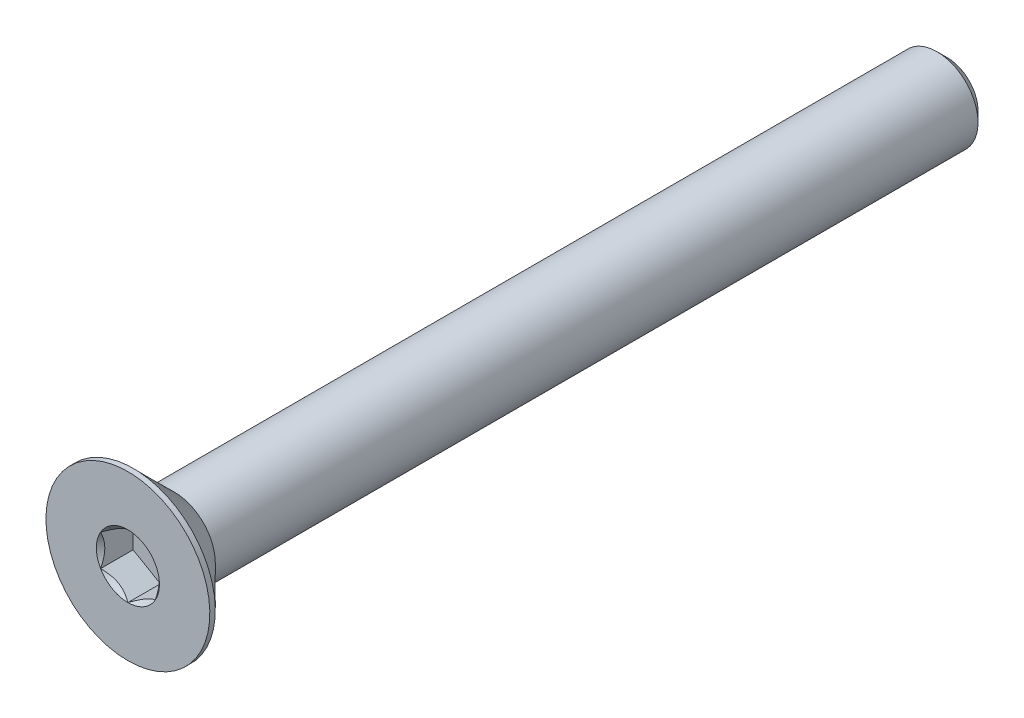
ISO-10303-21;
HEADER;
FILE_DESCRIPTION(('STEP AP214'),'2;1');
FILE_NAME('part.step','',(''),(''),'','','');
FILE_SCHEMA(('AUTOMOTIVE_DESIGN { 1 0 10303 214 1 1 1 1 }'));
ENDSEC;
DATA;
#1=APPLICATION_CONTEXT('core data for automotive mechanical design processes');
#2=APPLICATION_PROTOCOL_DEFINITION('international standard','automotive_design',2000,#1);
#3=PRODUCT_CONTEXT('',#1,'mechanical');
#4=PRODUCT('Part','Part','',(#3));
#5=PRODUCT_RELATED_PRODUCT_CATEGORY('part','',(#4));
#6=PRODUCT_DEFINITION_FORMATION('','',#4);
#7=PRODUCT_DEFINITION_CONTEXT('part definition',#1,'design');
#8=PRODUCT_DEFINITION('design','',#6,#7);
#9=PRODUCT_DEFINITION_SHAPE('','',#8);
#10=(LENGTH_UNIT() NAMED_UNIT(*) SI_UNIT(.MILLI.,.METRE.));
#11=(NAMED_UNIT(*) PLANE_ANGLE_UNIT() SI_UNIT($,.RADIAN.));
#12=(NAMED_UNIT(*) SI_UNIT($,.STERADIAN.) SOLID_ANGLE_UNIT());
#13=UNCERTAINTY_MEASURE_WITH_UNIT(LENGTH_MEASURE(1.E-05),#10,'distance_accuracy_value','');
#14=(GEOMETRIC_REPRESENTATION_CONTEXT(3) GLOBAL_UNCERTAINTY_ASSIGNED_CONTEXT((#13)) GLOBAL_UNIT_ASSIGNED_CONTEXT((#10,
#11,#12)) REPRESENTATION_CONTEXT('',''));
#15=CARTESIAN_POINT('',(0.,0.,0.));
#16=DIRECTION('',(0.,0.,1.));
#17=DIRECTION('',(1.,0.,0.));
#18=AXIS2_PLACEMENT_3D('',#15,#16,#17);
#19=CARTESIAN_POINT('',(0.,0.,-30.));
#20=DIRECTION('',(0.,0.,-1.));
#21=DIRECTION('',(0.,1.,0.));
#22=AXIS2_PLACEMENT_3D('',#19,#20,#21);
#23=CYLINDRICAL_SURFACE('',#22,1.5);
#24=CARTESIAN_POINT('',(0.,0.,-29.625));
#25=DIRECTION('',(0.,0.,-1.));
#26=DIRECTION('',(0.,1.,0.));
#27=AXIS2_PLACEMENT_3D('',#24,#25,#26);
#28=CIRCLE('',#27,1.5);
#29=CARTESIAN_POINT('',(0.,1.5,-29.625));
#30=VERTEX_POINT('',#29);
#31=EDGE_CURVE('E53',#30,#30,#28,.F.);
#32=ORIENTED_EDGE('',*,*,#31,.T.);
#33=EDGE_LOOP('',(#32));
#34=FACE_BOUND('',#33,.T.);
#35=CARTESIAN_POINT('',(0.,0.,-1.7));
#36=DIRECTION('',(0.,0.,1.));
#37=DIRECTION('',(0.,-1.,0.));
#38=AXIS2_PLACEMENT_3D('',#35,#36,#37);
#39=CIRCLE('',#38,1.5);
#40=CARTESIAN_POINT('',(0.,-1.5,-1.7));
#41=VERTEX_POINT('',#40);
#42=EDGE_CURVE('E171',#41,#41,#39,.T.);
#43=ORIENTED_EDGE('',*,*,#42,.F.);
#44=EDGE_LOOP('',(#43));
#45=FACE_BOUND('',#44,.T.);
#46=ADVANCED_FACE('F40',(#34,#45),#23,.T.);
#47=CARTESIAN_POINT('',(0.,-1.5,-30.));
#48=DIRECTION('',(0.,0.,-1.));
#49=DIRECTION('',(0.,1.,0.));
#50=AXIS2_PLACEMENT_3D('',#47,#48,#49);
#51=PLANE('',#50);
#52=CARTESIAN_POINT('',(0.,0.,-30.));
#53=DIRECTION('',(0.,0.,-1.));
#54=DIRECTION('',(0.,1.,0.));
#55=AXIS2_PLACEMENT_3D('',#52,#53,#54);
#56=CIRCLE('',#55,1.12500000000001);
#57=CARTESIAN_POINT('',(0.,1.12500000000001,-30.));
#58=VERTEX_POINT('',#57);
#59=EDGE_CURVE('E180',#58,#58,#56,.T.);
#60=ORIENTED_EDGE('',*,*,#59,.T.);
#61=EDGE_LOOP('',(#60));
#62=FACE_BOUND('',#61,.T.);
#63=ADVANCED_FACE('F190',(#62),#51,.T.);
#64=CARTESIAN_POINT('',(0.,0.,-30.));
#65=DIRECTION('',(0.,0.,1.));
#66=DIRECTION('',(0.,-1.,0.));
#67=AXIS2_PLACEMENT_3D('',#64,#65,#66);
#68=CONICAL_SURFACE('',#67,1.12500000000001,0.785398163397447);
#69=ORIENTED_EDGE('',*,*,#31,.F.);
#70=EDGE_LOOP('',(#69));
#71=FACE_BOUND('',#70,.T.);
#72=ORIENTED_EDGE('',*,*,#59,.F.);
#73=EDGE_LOOP('',(#72));
#74=FACE_BOUND('',#73,.T.);
#75=ADVANCED_FACE('F42',(#71,#74),#68,.T.);
#76=CARTESIAN_POINT('',(0.,0.,0.));
#77=DIRECTION('',(0.,0.,1.));
#78=DIRECTION('',(0.,-1.,0.));
#79=AXIS2_PLACEMENT_3D('',#76,#77,#78);
#80=CYLINDRICAL_SURFACE('',#79,3.);
#81=CARTESIAN_POINT('',(0.,0.,0.));
#82=DIRECTION('',(0.,0.,1.));
#83=DIRECTION('',(0.,-1.,0.));
#84=AXIS2_PLACEMENT_3D('',#81,#82,#83);
#85=CIRCLE('',#84,3.);
#86=CARTESIAN_POINT('',(0.,-3.,0.));
#87=VERTEX_POINT('',#86);
#88=EDGE_CURVE('E177',#87,#87,#85,.T.);
#89=ORIENTED_EDGE('',*,*,#88,.F.);
#90=EDGE_LOOP('',(#89));
#91=FACE_BOUND('',#90,.T.);
#92=CARTESIAN_POINT('',(0.,0.,-0.200000000000007));
#93=DIRECTION('',(0.,0.,1.));
#94=DIRECTION('',(0.,-1.,0.));
#95=AXIS2_PLACEMENT_3D('',#92,#93,#94);
#96=CIRCLE('',#95,3.);
#97=CARTESIAN_POINT('',(0.,-3.,-0.200000000000004));
#98=VERTEX_POINT('',#97);
#99=EDGE_CURVE('E174',#98,#98,#96,.T.);
#100=ORIENTED_EDGE('',*,*,#99,.T.);
#101=EDGE_LOOP('',(#100));
#102=FACE_BOUND('',#101,.T.);
#103=ADVANCED_FACE('F189',(#91,#102),#80,.T.);
#104=CARTESIAN_POINT('',(0.,0.,-1.7));
#105=DIRECTION('',(0.,0.,1.));
#106=DIRECTION('',(0.,-1.,0.));
#107=AXIS2_PLACEMENT_3D('',#104,#105,#106);
#108=CONICAL_SURFACE('',#107,1.5,0.78539816339745);
#109=ORIENTED_EDGE('',*,*,#99,.F.);
#110=EDGE_LOOP('',(#109));
#111=FACE_BOUND('',#110,.T.);
#112=ORIENTED_EDGE('',*,*,#42,.T.);
#113=EDGE_LOOP('',(#112));
#114=FACE_BOUND('',#113,.T.);
#115=ADVANCED_FACE('F200',(#111,#114),#108,.T.);
#116=CARTESIAN_POINT('',(0.,-1.5,0.));
#117=DIRECTION('',(0.,0.,1.));
#118=DIRECTION('',(0.,-1.,0.));
#119=AXIS2_PLACEMENT_3D('',#116,#117,#118);
#120=PLANE('',#119);
#121=CARTESIAN_POINT('',(0.,0.,0.));
#122=DIRECTION('',(0.,0.,1.));
#123=DIRECTION('',(1.,0.,0.));
#124=AXIS2_PLACEMENT_3D('',#121,#122,#123);
#125=CIRCLE('',#124,1.15470053837925);
#126=CARTESIAN_POINT('',(0.,-1.15470053837925,0.));
#127=VERTEX_POINT('',#126);
#128=CARTESIAN_POINT('',(1.,-0.577350269189626,0.));
#129=VERTEX_POINT('',#128);
#130=EDGE_CURVE('E99',#127,#129,#125,.T.);
#131=ORIENTED_EDGE('',*,*,#130,.F.);
#132=CARTESIAN_POINT('',(-1.,-0.577350269189626,0.));
#133=VERTEX_POINT('',#132);
#134=EDGE_CURVE('E59',#133,#127,#125,.T.);
#135=ORIENTED_EDGE('',*,*,#134,.F.);
#136=CARTESIAN_POINT('',(-1.,0.577350269189626,0.));
#137=VERTEX_POINT('',#136);
#138=EDGE_CURVE('E141',#137,#133,#125,.T.);
#139=ORIENTED_EDGE('',*,*,#138,.F.);
#140=CARTESIAN_POINT('',(0.,1.15470053837925,0.));
#141=VERTEX_POINT('',#140);
#142=EDGE_CURVE('E66',#141,#137,#125,.T.);
#143=ORIENTED_EDGE('',*,*,#142,.F.);
#144=CARTESIAN_POINT('',(1.,0.577350269189626,0.));
#145=VERTEX_POINT('',#144);
#146=EDGE_CURVE('E135',#145,#141,#125,.T.);
#147=ORIENTED_EDGE('',*,*,#146,.F.);
#148=EDGE_CURVE('E107',#129,#145,#125,.T.);
#149=ORIENTED_EDGE('',*,*,#148,.F.);
#150=EDGE_LOOP('',(#131,#135,#139,#143,#147,#149));
#151=FACE_BOUND('',#150,.T.);
#152=ORIENTED_EDGE('',*,*,#88,.T.);
#153=EDGE_LOOP('',(#152));
#154=FACE_BOUND('',#153,.T.);
#155=ADVANCED_FACE('F133',(#151,#154),#120,.T.);
#156=CARTESIAN_POINT('',(0.,0.,0.));
#157=DIRECTION('',(0.,0.,1.));
#158=DIRECTION('',(1.,0.,0.));
#159=AXIS2_PLACEMENT_3D('',#156,#157,#158);
#160=CONICAL_SURFACE('',#159,1.15470053837925,0.78539816339745);
#161=ORIENTED_EDGE('',*,*,#148,.T.);
#162=CARTESIAN_POINT('',(1.,-1.15147208646462,0.370385677513862));
#163=CARTESIAN_POINT('',(1.,-1.12343447988552,0.349219919873712));
#164=CARTESIAN_POINT('',(1.,-1.09524064850697,0.32826169217591));
#165=CARTESIAN_POINT('',(1.,-1.03847715644376,0.286846022235622));
#166=CARTESIAN_POINT('',(1.,-1.00990740382975,0.266388706123658));
#167=CARTESIAN_POINT('',(1.,-0.923120894333477,0.205604794954509));
#168=CARTESIAN_POINT('',(1.,-0.86425317375906,0.166192228961397));
#169=CARTESIAN_POINT('',(1.,-0.740809858258046,0.0888206642002048));
#170=CARTESIAN_POINT('',(1.,-0.676100255137808,0.051073039114342));
#171=CARTESIAN_POINT('',(1.,-0.543448939049125,-0.0179754124487085));
#172=CARTESIAN_POINT('',(1.,-0.475519112027779,-0.0492979721531351));
#173=CARTESIAN_POINT('',(1.,-0.373555850333529,-0.0876182211162057));
#174=CARTESIAN_POINT('',(1.,-0.341031989670908,-0.0986164083578443));
#175=CARTESIAN_POINT('',(1.,-0.275199079052294,-0.11800165785264));
#176=CARTESIAN_POINT('',(1.,-0.241889975173933,-0.126388540223301));
#177=CARTESIAN_POINT('',(1.,-0.175247517042993,-0.139974779280984));
#178=CARTESIAN_POINT('',(1.,-0.141925568218175,-0.145229209232033));
#179=CARTESIAN_POINT('',(1.,-0.0749144362322793,-0.152451313429109));
#180=CARTESIAN_POINT('',(1.,-0.0412251978501621,-0.154418486389493));
#181=CARTESIAN_POINT('',(1.,0.0249580992634207,-0.15491680160684));
#182=CARTESIAN_POINT('',(1.,0.0574512826460391,-0.153569732111367));
#183=CARTESIAN_POINT('',(1.,0.122148505701867,-0.147783515501016));
#184=CARTESIAN_POINT('',(1.,0.154352610132926,-0.143345079338465));
#185=CARTESIAN_POINT('',(1.,0.21879989886764,-0.131543169854797));
#186=CARTESIAN_POINT('',(1.,0.251033743268953,-0.124129458961492));
#187=CARTESIAN_POINT('',(1.,0.314797132354919,-0.106771057501325));
#188=CARTESIAN_POINT('',(1.,0.346326735731004,-0.0968265787111712));
#189=CARTESIAN_POINT('',(1.,0.445594187730205,-0.0617765174456643));
#190=CARTESIAN_POINT('',(1.,0.511919139476036,-0.0326791416432765));
#191=CARTESIAN_POINT('',(1.,0.641453244657532,0.0320153296865037));
#192=CARTESIAN_POINT('',(1.,0.704650133126344,0.0676357767152406));
#193=CARTESIAN_POINT('',(1.,0.825428490174986,0.141123901346934));
#194=CARTESIAN_POINT('',(1.,0.883132947867684,0.178791947135462));
#195=CARTESIAN_POINT('',(1.,0.968148853704565,0.237022852943162));
#196=CARTESIAN_POINT('',(1.,0.996120570380285,0.256638475762855));
#197=CARTESIAN_POINT('',(1.,1.05168177729901,0.29638851706127));
#198=CARTESIAN_POINT('',(1.,1.079271369977,0.316522792198831));
#199=CARTESIAN_POINT('',(1.,1.10670185346329,0.33687211907297));
#200=B_SPLINE_CURVE_WITH_KNOTS('',3,(#162,#163,#164,#165,#166,#167,#168,#169,#170,#171,#172,
#173,#174,#175,#176,#177,#178,#179,#180,#181,#182,#183,#184,#185,#186,#187,#188,#189,#190,#191,
#192,#193,#194,#195,#196,#197,#198,#199),.UNSPECIFIED.,.F.,.F.,(4,2,2,2,2,2,2,2,2,2,2,2,2,2,2,2,
2,2,4),(0.,0.105386459083291,0.210799187330125,0.423233611565469,0.647793540908504,
0.87158087773861,0.974493074181422,1.07741235827201,1.17846428203205,1.27953161415762,
1.37694086739611,1.47432772585408,1.57343322804293,1.67253043972851,1.88917353996827,
2.10660791038813,2.31323734249843,2.41572589232045,2.51818641476503),.UNSPECIFIED.);
#201=EDGE_CURVE('E11',#129,#145,#200,.T.);
#202=ORIENTED_EDGE('',*,*,#201,.F.);
#203=EDGE_LOOP('',(#161,#202));
#204=FACE_BOUND('',#203,.T.);
#205=ADVANCED_FACE('F111',(#204),#160,.F.);
#206=ORIENTED_EDGE('',*,*,#146,.T.);
#207=CARTESIAN_POINT('',(1.0002,0.577234799135788,0.00011548737261379));
#208=CARTESIAN_POINT('',(0.965817404992819,0.597085599618622,-0.0197220691742671));
#209=CARTESIAN_POINT('',(0.930859881860175,0.617268335009457,-0.0383949793611112));
#210=CARTESIAN_POINT('',(0.85957719704391,0.658423412276686,-0.0725852572768423));
#211=CARTESIAN_POINT('',(0.823245249471016,0.67939967198808,-0.0880835909765416));
#212=CARTESIAN_POINT('',(0.749983386196689,0.721697428470847,-0.114632692857735));
#213=CARTESIAN_POINT('',(0.713072148554585,0.743008141459637,-0.125750226003074));
#214=CARTESIAN_POINT('',(0.638437270689141,0.786098608286186,-0.142880134223818));
#215=CARTESIAN_POINT('',(0.600715911891364,0.807877044942281,-0.148905302533327));
#216=CARTESIAN_POINT('',(0.535707801582066,0.845409494928863,-0.154339445032506));
#217=CARTESIAN_POINT('',(0.508505628471828,0.861114676896602,-0.155143061683268));
#218=CARTESIAN_POINT('',(0.454153959330888,0.892494627706029,-0.153793300583113));
#219=CARTESIAN_POINT('',(0.427004476245124,0.908169389073954,-0.151639270452801));
#220=CARTESIAN_POINT('',(0.34594372267304,0.954969836969511,-0.140883027871529));
#221=CARTESIAN_POINT('',(0.292435859021572,0.985862616452447,-0.127985443584644));
#222=CARTESIAN_POINT('',(0.198523934856568,1.04008269114923,-0.0968592693978224));
#223=CARTESIAN_POINT('',(0.157679476328166,1.06366425027551,-0.0802622022981605));
#224=CARTESIAN_POINT('',(0.0775903626180563,1.1099037216352,-0.0428750753147073));
#225=CARTESIAN_POINT('',(0.0383409891295622,1.1325643579843,-0.0220986581825968));
#226=CARTESIAN_POINT('',(-0.00019999999999981,1.15481600843309,0.000115487372614069));
#227=B_SPLINE_CURVE_WITH_KNOTS('',3,(#207,#208,#209,#210,#211,#212,#213,#214,#215,#216,#217,
#218,#219,#220,#221,#222,#223,#224,#225,#226),.UNSPECIFIED.,.F.,.F.,(4,2,2,2,2,2,2,2,2,4),(0.,
0.133237676828559,0.26725222983449,0.3991370762693,0.530689603280768,0.624814864263846,
0.718960890149133,0.907306626112097,1.05710100361789,1.20641411519286),.UNSPECIFIED.);
#228=EDGE_CURVE('E137',#145,#141,#227,.T.);
#229=ORIENTED_EDGE('',*,*,#228,.F.);
#230=EDGE_LOOP('',(#206,#229));
#231=FACE_BOUND('',#230,.T.);
#232=ADVANCED_FACE('F276',(#231),#160,.F.);
#233=ORIENTED_EDGE('',*,*,#142,.T.);
#234=CARTESIAN_POINT('',(0.000200000000000086,1.15481600843309,0.000115487372613877));
#235=CARTESIAN_POINT('',(-0.0341825950071806,1.13496520795026,-0.0197220691742672));
#236=CARTESIAN_POINT('',(-0.0691401181398248,1.11478247255942,-0.0383949793611113));
#237=CARTESIAN_POINT('',(-0.14042280295609,1.07362739529219,-0.0725852572768423));
#238=CARTESIAN_POINT('',(-0.176754750528984,1.0526511355808,-0.0880835909765415));
#239=CARTESIAN_POINT('',(-0.250016613803311,1.01035337909803,-0.114632692857735));
#240=CARTESIAN_POINT('',(-0.286927851445414,0.989042666109241,-0.125750226003074));
#241=CARTESIAN_POINT('',(-0.361562729310859,0.945952199282691,-0.142880134223818));
#242=CARTESIAN_POINT('',(-0.399284088108636,0.924173762626597,-0.148905302533327));
#243=CARTESIAN_POINT('',(-0.464292198417934,0.886641312640015,-0.154339445032506));
#244=CARTESIAN_POINT('',(-0.491494371528172,0.870936130672276,-0.155143061683268));
#245=CARTESIAN_POINT('',(-0.545846040669112,0.839556179862848,-0.153793300583113));
#246=CARTESIAN_POINT('',(-0.572995523754876,0.823881418494924,-0.1516392704528));
#247=CARTESIAN_POINT('',(-0.65405627732696,0.777080970599367,-0.140883027871529));
#248=CARTESIAN_POINT('',(-0.707564140978428,0.74618819111643,-0.127985443584644));
#249=CARTESIAN_POINT('',(-0.801476065143432,0.69196811641965,-0.0968592693978227));
#250=CARTESIAN_POINT('',(-0.842320523671834,0.668386557293372,-0.0802622022981606));
#251=CARTESIAN_POINT('',(-0.922409637381944,0.622147085933682,-0.0428750753147073));
#252=CARTESIAN_POINT('',(-0.961659010870438,0.599486449584575,-0.0220986581825968));
#253=CARTESIAN_POINT('',(-1.0002,0.577234799135788,0.000115487372613852));
#254=B_SPLINE_CURVE_WITH_KNOTS('',3,(#234,#235,#236,#237,#238,#239,#240,#241,#242,#243,#244,
#245,#246,#247,#248,#249,#250,#251,#252,#253),.UNSPECIFIED.,.F.,.F.,(4,2,2,2,2,2,2,2,2,4),(0.,
0.133237676828559,0.26725222983449,0.3991370762693,0.530689603280768,0.624814864263846,
0.718960890149133,0.907306626112098,1.05710100361789,1.20641411519286),.UNSPECIFIED.);
#255=EDGE_CURVE('E140',#141,#137,#254,.T.);
#256=ORIENTED_EDGE('',*,*,#255,.F.);
#257=EDGE_LOOP('',(#233,#256));
#258=FACE_BOUND('',#257,.T.);
#259=ADVANCED_FACE('F272',(#258),#160,.F.);
#260=ORIENTED_EDGE('',*,*,#138,.T.);
#261=CARTESIAN_POINT('',(-1.,-1.15147208646462,0.370385677513861));
#262=CARTESIAN_POINT('',(-1.,-1.12343447988552,0.349219919873711));
#263=CARTESIAN_POINT('',(-1.,-1.09524064850697,0.328261692175909));
#264=CARTESIAN_POINT('',(-1.,-1.03847715644376,0.286846022235621));
#265=CARTESIAN_POINT('',(-1.,-1.00990740382975,0.266388706123658));
#266=CARTESIAN_POINT('',(-1.,-0.923120894333477,0.205604794954509));
#267=CARTESIAN_POINT('',(-1.,-0.864253173759059,0.166192228961397));
#268=CARTESIAN_POINT('',(-1.,-0.740809858258045,0.0888206642002045));
#269=CARTESIAN_POINT('',(-1.,-0.676100255137807,0.0510730391143416));
#270=CARTESIAN_POINT('',(-1.,-0.543448939049124,-0.0179754124487089));
#271=CARTESIAN_POINT('',(-1.,-0.475519112027779,-0.0492979721531352));
#272=CARTESIAN_POINT('',(-1.,-0.373555850333529,-0.0876182211162056));
#273=CARTESIAN_POINT('',(-1.,-0.341031989670908,-0.0986164083578442));
#274=CARTESIAN_POINT('',(-1.,-0.275199079052293,-0.11800165785264));
#275=CARTESIAN_POINT('',(-1.,-0.241889975173933,-0.126388540223301));
#276=CARTESIAN_POINT('',(-1.,-0.175247517042993,-0.139974779280984));
#277=CARTESIAN_POINT('',(-1.,-0.141925568218175,-0.145229209232033));
#278=CARTESIAN_POINT('',(-1.,-0.0749144362322789,-0.152451313429108));
#279=CARTESIAN_POINT('',(-1.,-0.0412251978501617,-0.154418486389493));
#280=CARTESIAN_POINT('',(-1.,0.0249580992634211,-0.15491680160684));
#281=CARTESIAN_POINT('',(-1.,0.0574512826460394,-0.153569732111366));
#282=CARTESIAN_POINT('',(-1.,0.122148505701867,-0.147783515501016));
#283=CARTESIAN_POINT('',(-1.,0.154352610132926,-0.143345079338465));
#284=CARTESIAN_POINT('',(-1.,0.21879989886764,-0.131543169854797));
#285=CARTESIAN_POINT('',(-1.,0.251033743268953,-0.124129458961491));
#286=CARTESIAN_POINT('',(-1.,0.314797132354919,-0.106771057501325));
#287=CARTESIAN_POINT('',(-1.,0.346326735731004,-0.0968265787111709));
#288=CARTESIAN_POINT('',(-1.,0.445594187730205,-0.0617765174456641));
#289=CARTESIAN_POINT('',(-1.,0.511919139476036,-0.0326791416432762));
#290=CARTESIAN_POINT('',(-1.,0.641453244657532,0.032015329686504));
#291=CARTESIAN_POINT('',(-1.,0.704650133126344,0.0676357767152409));
#292=CARTESIAN_POINT('',(-1.,0.825428490174986,0.141123901346934));
#293=CARTESIAN_POINT('',(-1.,0.883132947867684,0.178791947135462));
#294=CARTESIAN_POINT('',(-1.,0.968148853704565,0.237022852943162));
#295=CARTESIAN_POINT('',(-1.,0.996120570380285,0.256638475762855));
#296=CARTESIAN_POINT('',(-1.,1.05168177729901,0.29638851706127));
#297=CARTESIAN_POINT('',(-1.,1.079271369977,0.316522792198831));
#298=CARTESIAN_POINT('',(-1.,1.10670185346329,0.336872119072971));
#299=B_SPLINE_CURVE_WITH_KNOTS('',3,(#261,#262,#263,#264,#265,#266,#267,#268,#269,#270,#271,
#272,#273,#274,#275,#276,#277,#278,#279,#280,#281,#282,#283,#284,#285,#286,#287,#288,#289,#290,
#291,#292,#293,#294,#295,#296,#297,#298),.UNSPECIFIED.,.F.,.F.,(4,2,2,2,2,2,2,2,2,2,2,2,2,2,2,2,
2,2,4),(0.,0.105386459083291,0.210799187330124,0.423233611565469,0.647793540908503,
0.87158087773861,0.974493074181421,1.07741235827201,1.17846428203205,1.27953161415762,
1.3769408673961,1.47432772585408,1.57343322804293,1.67253043972851,1.88917353996827,
2.10660791038813,2.31323734249843,2.41572589232045,2.51818641476503),.UNSPECIFIED.);
#300=EDGE_CURVE('E147',#137,#133,#299,.F.);
#301=ORIENTED_EDGE('',*,*,#300,.F.);
#302=EDGE_LOOP('',(#260,#301));
#303=FACE_BOUND('',#302,.T.);
#304=ADVANCED_FACE('F145',(#303),#160,.F.);
#305=ORIENTED_EDGE('',*,*,#134,.T.);
#306=CARTESIAN_POINT('',(-1.0002,-0.577234799135788,0.000115487372614006));
#307=CARTESIAN_POINT('',(-0.965817404992819,-0.597085599618622,-0.019722069174267));
#308=CARTESIAN_POINT('',(-0.930859881860175,-0.617268335009457,-0.0383949793611112));
#309=CARTESIAN_POINT('',(-0.85957719704391,-0.658423412276686,-0.0725852572768421));
#310=CARTESIAN_POINT('',(-0.823245249471016,-0.67939967198808,-0.0880835909765414));
#311=CARTESIAN_POINT('',(-0.749983386196689,-0.721697428470846,-0.114632692857735));
#312=CARTESIAN_POINT('',(-0.713072148554586,-0.743008141459637,-0.125750226003074));
#313=CARTESIAN_POINT('',(-0.638437270689141,-0.786098608286186,-0.142880134223818));
#314=CARTESIAN_POINT('',(-0.600715911891364,-0.807877044942281,-0.148905302533327));
#315=CARTESIAN_POINT('',(-0.535707801582066,-0.845409494928863,-0.154339445032506));
#316=CARTESIAN_POINT('',(-0.508505628471828,-0.861114676896602,-0.155143061683268));
#317=CARTESIAN_POINT('',(-0.454153959330888,-0.892494627706029,-0.153793300583113));
#318=CARTESIAN_POINT('',(-0.427004476245124,-0.908169389073954,-0.151639270452801));
#319=CARTESIAN_POINT('',(-0.34594372267304,-0.954969836969511,-0.140883027871529));
#320=CARTESIAN_POINT('',(-0.292435859021572,-0.985862616452447,-0.127985443584644));
#321=CARTESIAN_POINT('',(-0.198523934856568,-1.04008269114923,-0.0968592693978225));
#322=CARTESIAN_POINT('',(-0.157679476328166,-1.06366425027551,-0.0802622022981606));
#323=CARTESIAN_POINT('',(-0.0775903626180563,-1.1099037216352,-0.0428750753147074));
#324=CARTESIAN_POINT('',(-0.0383409891295623,-1.1325643579843,-0.022098658182597));
#325=CARTESIAN_POINT('',(0.000199999999999814,-1.15481600843309,0.000115487372613911));
#326=B_SPLINE_CURVE_WITH_KNOTS('',3,(#306,#307,#308,#309,#310,#311,#312,#313,#314,#315,#316,
#317,#318,#319,#320,#321,#322,#323,#324,#325),.UNSPECIFIED.,.F.,.F.,(4,2,2,2,2,2,2,2,2,4),(0.,
0.133237676828559,0.26725222983449,0.3991370762693,0.530689603280768,0.624814864263846,
0.718960890149133,0.907306626112098,1.05710100361789,1.20641411519286),.UNSPECIFIED.);
#327=EDGE_CURVE('E123',#133,#127,#326,.T.);
#328=ORIENTED_EDGE('',*,*,#327,.F.);
#329=EDGE_LOOP('',(#305,#328));
#330=FACE_BOUND('',#329,.T.);
#331=ADVANCED_FACE('F227',(#330),#160,.F.);
#332=ORIENTED_EDGE('',*,*,#130,.T.);
#333=CARTESIAN_POINT('',(-0.000200000000000066,-1.15481600843309,0.000115487372613877));
#334=CARTESIAN_POINT('',(0.0341825950071807,-1.13496520795026,-0.019722069174267));
#335=CARTESIAN_POINT('',(0.0691401181398249,-1.11478247255942,-0.0383949793611111));
#336=CARTESIAN_POINT('',(0.14042280295609,-1.07362739529219,-0.0725852572768421));
#337=CARTESIAN_POINT('',(0.176754750528984,-1.0526511355808,-0.0880835909765414));
#338=CARTESIAN_POINT('',(0.250016613803311,-1.01035337909803,-0.114632692857735));
#339=CARTESIAN_POINT('',(0.286927851445414,-0.989042666109241,-0.125750226003074));
#340=CARTESIAN_POINT('',(0.361562729310859,-0.945952199282691,-0.142880134223818));
#341=CARTESIAN_POINT('',(0.399284088108636,-0.924173762626597,-0.148905302533327));
#342=CARTESIAN_POINT('',(0.464292198417934,-0.886641312640015,-0.154339445032506));
#343=CARTESIAN_POINT('',(0.491494371528172,-0.870936130672276,-0.155143061683268));
#344=CARTESIAN_POINT('',(0.545846040669112,-0.839556179862848,-0.153793300583113));
#345=CARTESIAN_POINT('',(0.572995523754876,-0.823881418494924,-0.151639270452801));
#346=CARTESIAN_POINT('',(0.65405627732696,-0.777080970599367,-0.140883027871529));
#347=CARTESIAN_POINT('',(0.707564140978428,-0.74618819111643,-0.127985443584644));
#348=CARTESIAN_POINT('',(0.801476065143432,-0.69196811641965,-0.0968592693978225));
#349=CARTESIAN_POINT('',(0.842320523671834,-0.668386557293372,-0.0802622022981604));
#350=CARTESIAN_POINT('',(0.922409637381943,-0.622147085933682,-0.042875075314707));
#351=CARTESIAN_POINT('',(0.961659010870438,-0.599486449584576,-0.0220986581825965));
#352=CARTESIAN_POINT('',(1.0002,-0.577234799135788,0.000115487372613976));
#353=B_SPLINE_CURVE_WITH_KNOTS('',3,(#333,#334,#335,#336,#337,#338,#339,#340,#341,#342,#343,
#344,#345,#346,#347,#348,#349,#350,#351,#352),.UNSPECIFIED.,.F.,.F.,(4,2,2,2,2,2,2,2,2,4),(0.,
0.133237676828559,0.26725222983449,0.3991370762693,0.530689603280768,0.624814864263846,
0.718960890149133,0.907306626112097,1.05710100361789,1.20641411519286),.UNSPECIFIED.);
#354=EDGE_CURVE('E103',#127,#129,#353,.T.);
#355=ORIENTED_EDGE('',*,*,#354,.F.);
#356=EDGE_LOOP('',(#332,#355));
#357=FACE_BOUND('',#356,.T.);
#358=ADVANCED_FACE('F101',(#357),#160,.F.);
#359=CARTESIAN_POINT('',(1.,-0.577350269189626,-1.19));
#360=DIRECTION('',(0.,0.,1.));
#361=DIRECTION('',(1.,0.,0.));
#362=AXIS2_PLACEMENT_3D('',#359,#360,#361);
#363=PLANE('',#362);
#364=DIRECTION('',(0.866025403784439,0.5,0.));
#365=VECTOR('',#364,1.);
#366=CARTESIAN_POINT('',(0.,-1.15470053837925,-1.19));
#367=LINE('',#366,#365);
#368=CARTESIAN_POINT('',(0.,-1.15470053837925,-1.19));
#369=VERTEX_POINT('',#368);
#370=CARTESIAN_POINT('',(1.,-0.577350269189626,-1.19));
#371=VERTEX_POINT('',#370);
#372=EDGE_CURVE('E122',#369,#371,#367,.T.);
#373=ORIENTED_EDGE('',*,*,#372,.T.);
#374=DIRECTION('',(0.,1.,0.));
#375=VECTOR('',#374,1.);
#376=CARTESIAN_POINT('',(1.,-0.577350269189626,-1.19));
#377=LINE('',#376,#375);
#378=CARTESIAN_POINT('',(1.,0.577350269189626,-1.19));
#379=VERTEX_POINT('',#378);
#380=EDGE_CURVE('E127',#371,#379,#377,.T.);
#381=ORIENTED_EDGE('',*,*,#380,.T.);
#382=DIRECTION('',(-0.866025403784439,0.5,0.));
#383=VECTOR('',#382,1.);
#384=CARTESIAN_POINT('',(1.,0.577350269189626,-1.19));
#385=LINE('',#384,#383);
#386=CARTESIAN_POINT('',(0.,1.15470053837925,-1.19));
#387=VERTEX_POINT('',#386);
#388=EDGE_CURVE('E258',#379,#387,#385,.T.);
#389=ORIENTED_EDGE('',*,*,#388,.T.);
#390=DIRECTION('',(-0.866025403784439,-0.5,0.));
#391=VECTOR('',#390,1.);
#392=CARTESIAN_POINT('',(0.,1.15470053837925,-1.19));
#393=LINE('',#392,#391);
#394=CARTESIAN_POINT('',(-1.,0.577350269189626,-1.19));
#395=VERTEX_POINT('',#394);
#396=EDGE_CURVE('E260',#387,#395,#393,.T.);
#397=ORIENTED_EDGE('',*,*,#396,.T.);
#398=DIRECTION('',(0.,-1.,0.));
#399=VECTOR('',#398,1.);
#400=CARTESIAN_POINT('',(-1.,0.577350269189626,-1.19));
#401=LINE('',#400,#399);
#402=CARTESIAN_POINT('',(-1.,-0.577350269189626,-1.19));
#403=VERTEX_POINT('',#402);
#404=EDGE_CURVE('E162',#395,#403,#401,.T.);
#405=ORIENTED_EDGE('',*,*,#404,.T.);
#406=DIRECTION('',(0.866025403784439,-0.5,0.));
#407=VECTOR('',#406,1.);
#408=CARTESIAN_POINT('',(-1.,-0.577350269189626,-1.19));
#409=LINE('',#408,#407);
#410=EDGE_CURVE('E130',#403,#369,#409,.T.);
#411=ORIENTED_EDGE('',*,*,#410,.T.);
#412=EDGE_LOOP('',(#373,#381,#389,#397,#405,#411));
#413=FACE_BOUND('',#412,.T.);
#414=ADVANCED_FACE('F226',(#413),#363,.T.);
#415=CARTESIAN_POINT('',(1.,-0.577350269189626,-1.19));
#416=DIRECTION('',(1.,0.,0.));
#417=DIRECTION('',(0.,0.,-1.));
#418=AXIS2_PLACEMENT_3D('',#415,#416,#417);
#419=PLANE('',#418);
#420=DIRECTION('',(0.,0.,1.));
#421=VECTOR('',#420,1.);
#422=CARTESIAN_POINT('',(1.,-0.577350269189626,-1.19));
#423=LINE('',#422,#421);
#424=EDGE_CURVE('E119',#371,#129,#423,.T.);
#425=ORIENTED_EDGE('',*,*,#424,.T.);
#426=ORIENTED_EDGE('',*,*,#201,.T.);
#427=DIRECTION('',(0.,0.,1.));
#428=VECTOR('',#427,1.);
#429=CARTESIAN_POINT('',(1.,0.577350269189626,-1.19));
#430=LINE('',#429,#428);
#431=EDGE_CURVE('E129',#379,#145,#430,.T.);
#432=ORIENTED_EDGE('',*,*,#431,.F.);
#433=ORIENTED_EDGE('',*,*,#380,.F.);
#434=EDGE_LOOP('',(#425,#426,#432,#433));
#435=FACE_BOUND('',#434,.T.);
#436=ADVANCED_FACE('F125',(#435),#419,.F.);
#437=CARTESIAN_POINT('',(1.,0.577350269189626,-1.19));
#438=DIRECTION('',(0.5,0.866025403784439,0.));
#439=DIRECTION('',(-0.866025403784439,0.5,0.));
#440=AXIS2_PLACEMENT_3D('',#437,#438,#439);
#441=PLANE('',#440);
#442=ORIENTED_EDGE('',*,*,#431,.T.);
#443=ORIENTED_EDGE('',*,*,#228,.T.);
#444=DIRECTION('',(0.,0.,1.));
#445=VECTOR('',#444,1.);
#446=CARTESIAN_POINT('',(0.,1.15470053837925,-1.19));
#447=LINE('',#446,#445);
#448=EDGE_CURVE('E158',#387,#141,#447,.T.);
#449=ORIENTED_EDGE('',*,*,#448,.F.);
#450=ORIENTED_EDGE('',*,*,#388,.F.);
#451=EDGE_LOOP('',(#442,#443,#449,#450));
#452=FACE_BOUND('',#451,.T.);
#453=ADVANCED_FACE('F249',(#452),#441,.F.);
#454=CARTESIAN_POINT('',(0.,1.15470053837925,-1.19));
#455=DIRECTION('',(-0.5,0.866025403784439,0.));
#456=DIRECTION('',(-0.866025403784439,-0.5,0.));
#457=AXIS2_PLACEMENT_3D('',#454,#455,#456);
#458=PLANE('',#457);
#459=ORIENTED_EDGE('',*,*,#448,.T.);
#460=ORIENTED_EDGE('',*,*,#255,.T.);
#461=DIRECTION('',(0.,0.,1.));
#462=VECTOR('',#461,1.);
#463=CARTESIAN_POINT('',(-1.,0.577350269189626,-1.19));
#464=LINE('',#463,#462);
#465=EDGE_CURVE('E156',#395,#137,#464,.T.);
#466=ORIENTED_EDGE('',*,*,#465,.F.);
#467=ORIENTED_EDGE('',*,*,#396,.F.);
#468=EDGE_LOOP('',(#459,#460,#466,#467));
#469=FACE_BOUND('',#468,.T.);
#470=ADVANCED_FACE('F154',(#469),#458,.F.);
#471=CARTESIAN_POINT('',(-1.,0.577350269189626,-1.19));
#472=DIRECTION('',(-1.,0.,0.));
#473=DIRECTION('',(0.,0.,1.));
#474=AXIS2_PLACEMENT_3D('',#471,#472,#473);
#475=PLANE('',#474);
#476=ORIENTED_EDGE('',*,*,#465,.T.);
#477=ORIENTED_EDGE('',*,*,#300,.T.);
#478=DIRECTION('',(0.,0.,1.));
#479=VECTOR('',#478,1.);
#480=CARTESIAN_POINT('',(-1.,-0.577350269189626,-1.19));
#481=LINE('',#480,#479);
#482=EDGE_CURVE('E164',#403,#133,#481,.T.);
#483=ORIENTED_EDGE('',*,*,#482,.F.);
#484=ORIENTED_EDGE('',*,*,#404,.F.);
#485=EDGE_LOOP('',(#476,#477,#483,#484));
#486=FACE_BOUND('',#485,.T.);
#487=ADVANCED_FACE('F160',(#486),#475,.F.);
#488=CARTESIAN_POINT('',(-1.,-0.577350269189626,-1.19));
#489=DIRECTION('',(-0.5,-0.866025403784439,0.));
#490=DIRECTION('',(0.866025403784439,-0.5,0.));
#491=AXIS2_PLACEMENT_3D('',#488,#489,#490);
#492=PLANE('',#491);
#493=ORIENTED_EDGE('',*,*,#482,.T.);
#494=ORIENTED_EDGE('',*,*,#327,.T.);
#495=DIRECTION('',(0.,0.,1.));
#496=VECTOR('',#495,1.);
#497=CARTESIAN_POINT('',(0.,-1.15470053837925,-1.19));
#498=LINE('',#497,#496);
#499=EDGE_CURVE('E121',#369,#127,#498,.T.);
#500=ORIENTED_EDGE('',*,*,#499,.F.);
#501=ORIENTED_EDGE('',*,*,#410,.F.);
#502=EDGE_LOOP('',(#493,#494,#500,#501));
#503=FACE_BOUND('',#502,.T.);
#504=ADVANCED_FACE('F210',(#503),#492,.F.);
#505=CARTESIAN_POINT('',(0.,-1.15470053837925,-1.19));
#506=DIRECTION('',(0.5,-0.866025403784439,0.));
#507=DIRECTION('',(0.866025403784439,0.5,0.));
#508=AXIS2_PLACEMENT_3D('',#505,#506,#507);
#509=PLANE('',#508);
#510=ORIENTED_EDGE('',*,*,#499,.T.);
#511=ORIENTED_EDGE('',*,*,#354,.T.);
#512=ORIENTED_EDGE('',*,*,#424,.F.);
#513=ORIENTED_EDGE('',*,*,#372,.F.);
#514=EDGE_LOOP('',(#510,#511,#512,#513));
#515=FACE_BOUND('',#514,.T.);
#516=ADVANCED_FACE('F117',(#515),#509,.F.);
#517=CLOSED_SHELL('',(#46,#63,#75,#103,#115,#155,#205,#232,#259,#304,#331,#358,#414,#436,#453,
#470,#487,#504,#516));
#518=MANIFOLD_SOLID_BREP('B2',#517);
#519=ADVANCED_BREP_SHAPE_REPRESENTATION('',(#18,#518),#14);
#520=SHAPE_DEFINITION_REPRESENTATION(#9,#519);
ENDSEC;
END-ISO-10303-21;
